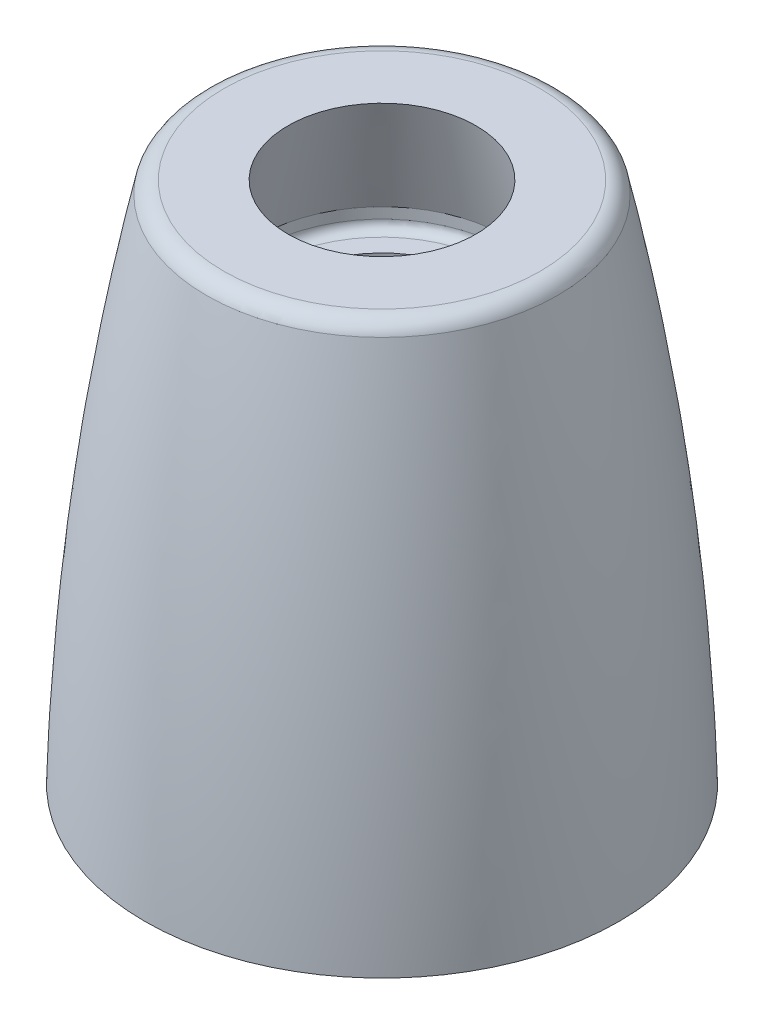
ISO-10303-21;
HEADER;
FILE_DESCRIPTION(('STEP AP214'),'2;1');
FILE_NAME('part.step','',(''),(''),'','','');
FILE_SCHEMA(('AUTOMOTIVE_DESIGN { 1 0 10303 214 1 1 1 1 }'));
ENDSEC;
DATA;
#1=APPLICATION_CONTEXT('core data for automotive mechanical design processes');
#2=APPLICATION_PROTOCOL_DEFINITION('international standard','automotive_design',2000,#1);
#3=PRODUCT_CONTEXT('',#1,'mechanical');
#4=PRODUCT('Part','Part','',(#3));
#5=PRODUCT_RELATED_PRODUCT_CATEGORY('part','',(#4));
#6=PRODUCT_DEFINITION_FORMATION('','',#4);
#7=PRODUCT_DEFINITION_CONTEXT('part definition',#1,'design');
#8=PRODUCT_DEFINITION('design','',#6,#7);
#9=PRODUCT_DEFINITION_SHAPE('','',#8);
#10=(LENGTH_UNIT() NAMED_UNIT(*) SI_UNIT(.MILLI.,.METRE.));
#11=(NAMED_UNIT(*) PLANE_ANGLE_UNIT() SI_UNIT($,.RADIAN.));
#12=(NAMED_UNIT(*) SI_UNIT($,.STERADIAN.) SOLID_ANGLE_UNIT());
#13=UNCERTAINTY_MEASURE_WITH_UNIT(LENGTH_MEASURE(1.E-05),#10,'distance_accuracy_value','');
#14=(GEOMETRIC_REPRESENTATION_CONTEXT(3) GLOBAL_UNCERTAINTY_ASSIGNED_CONTEXT((#13)) GLOBAL_UNIT_ASSIGNED_CONTEXT((#10,
#11,#12)) REPRESENTATION_CONTEXT('',''));
#15=CARTESIAN_POINT('',(0.,0.,0.));
#16=DIRECTION('',(0.,0.,1.));
#17=DIRECTION('',(1.,0.,0.));
#18=AXIS2_PLACEMENT_3D('',#15,#16,#17);
#19=CARTESIAN_POINT('',(0.,31.0037578537676,0.));
#20=DIRECTION('',(0.,1.,0.));
#21=DIRECTION('',(0.,0.,1.));
#22=AXIS2_PLACEMENT_3D('',#19,#20,#21);
#23=CYLINDRICAL_SURFACE('',#22,5.175);
#24=CARTESIAN_POINT('',(0.,24.3246111856191,0.));
#25=DIRECTION('',(0.,1.,0.));
#26=DIRECTION('',(0.,0.,1.));
#27=AXIS2_PLACEMENT_3D('',#24,#25,#26);
#28=CIRCLE('',#27,5.175);
#29=CARTESIAN_POINT('',(0.,24.3246111856191,5.175));
#30=VERTEX_POINT('',#29);
#31=CARTESIAN_POINT('',(0.,24.3246111856191,-5.175));
#32=VERTEX_POINT('',#31);
#33=EDGE_CURVE('E11',#30,#32,#28,.T.);
#34=ORIENTED_EDGE('',*,*,#33,.T.);
#35=DIRECTION('',(0.,-1.,0.));
#36=VECTOR('',#35,1.);
#37=CARTESIAN_POINT('',(0.,31.0037578537676,-5.175));
#38=LINE('',#37,#36);
#39=CARTESIAN_POINT('',(0.,15.7722628656191,-5.175));
#40=VERTEX_POINT('',#39);
#41=EDGE_CURVE('E27',#32,#40,#38,.T.);
#42=ORIENTED_EDGE('',*,*,#41,.T.);
#43=CARTESIAN_POINT('',(0.,15.7722628656191,0.));
#44=DIRECTION('',(0.,1.,0.));
#45=DIRECTION('',(0.,0.,1.));
#46=AXIS2_PLACEMENT_3D('',#43,#44,#45);
#47=CIRCLE('',#46,5.175);
#48=CARTESIAN_POINT('',(0.,15.7722628656191,5.175));
#49=VERTEX_POINT('',#48);
#50=EDGE_CURVE('E179',#49,#40,#47,.T.);
#51=ORIENTED_EDGE('',*,*,#50,.F.);
#52=CARTESIAN_POINT('',(0.,15.7722628656191,0.));
#53=DIRECTION('',(0.,1.,0.));
#54=DIRECTION('',(0.,0.,1.));
#55=AXIS2_PLACEMENT_3D('',#52,#53,#54);
#56=CIRCLE('',#55,5.175);
#57=EDGE_CURVE('E126',#40,#49,#56,.T.);
#58=ORIENTED_EDGE('',*,*,#57,.F.);
#59=ORIENTED_EDGE('',*,*,#41,.F.);
#60=CARTESIAN_POINT('',(0.,24.3246111856191,0.));
#61=DIRECTION('',(0.,1.,0.));
#62=DIRECTION('',(0.,0.,1.));
#63=AXIS2_PLACEMENT_3D('',#60,#61,#62);
#64=CIRCLE('',#63,5.175);
#65=EDGE_CURVE('E182',#32,#30,#64,.T.);
#66=ORIENTED_EDGE('',*,*,#65,.T.);
#67=EDGE_LOOP('',(#34,#42,#51,#58,#59,#66));
#68=FACE_BOUND('',#67,.T.);
#69=ADVANCED_FACE('F16',(#68),#23,.F.);
#70=CARTESIAN_POINT('',(0.,13.7722628656191,0.));
#71=DIRECTION('',(0.,-1.,0.));
#72=DIRECTION('',(0.,0.,1.));
#73=AXIS2_PLACEMENT_3D('',#70,#71,#72);
#74=TOROIDAL_SURFACE('',#73,7.779,2.);
#75=CARTESIAN_POINT('',(0.,15.7722628656191,0.));
#76=DIRECTION('',(0.,1.,0.));
#77=DIRECTION('',(0.,0.,1.));
#78=AXIS2_PLACEMENT_3D('',#75,#76,#77);
#79=CIRCLE('',#78,7.779);
#80=CARTESIAN_POINT('',(0.,15.7722628656191,7.779));
#81=VERTEX_POINT('',#80);
#82=CARTESIAN_POINT('',(0.,15.7722628656191,-7.779));
#83=VERTEX_POINT('',#82);
#84=EDGE_CURVE('E203',#81,#83,#79,.T.);
#85=ORIENTED_EDGE('',*,*,#84,.T.);
#86=CARTESIAN_POINT('',(0.,13.7722628656191,-7.779));
#87=DIRECTION('',(-1.,0.,0.));
#88=DIRECTION('',(0.,0.,-1.));
#89=AXIS2_PLACEMENT_3D('',#86,#87,#88);
#90=CIRCLE('',#89,2.);
#91=CARTESIAN_POINT('',(0.,13.7722628656191,-9.779));
#92=VERTEX_POINT('',#91);
#93=EDGE_CURVE('E200',#83,#92,#90,.T.);
#94=ORIENTED_EDGE('',*,*,#93,.T.);
#95=CARTESIAN_POINT('',(0.,13.7722628656191,0.));
#96=DIRECTION('',(0.,1.,0.));
#97=DIRECTION('',(0.,0.,1.));
#98=AXIS2_PLACEMENT_3D('',#95,#96,#97);
#99=CIRCLE('',#98,9.779);
#100=CARTESIAN_POINT('',(0.,13.7722628656191,9.779));
#101=VERTEX_POINT('',#100);
#102=EDGE_CURVE('E185',#101,#92,#99,.T.);
#103=ORIENTED_EDGE('',*,*,#102,.F.);
#104=CARTESIAN_POINT('',(0.,13.7722628656191,0.));
#105=DIRECTION('',(0.,1.,0.));
#106=DIRECTION('',(0.,0.,1.));
#107=AXIS2_PLACEMENT_3D('',#104,#105,#106);
#108=CIRCLE('',#107,9.779);
#109=EDGE_CURVE('E199',#92,#101,#108,.T.);
#110=ORIENTED_EDGE('',*,*,#109,.F.);
#111=ORIENTED_EDGE('',*,*,#93,.F.);
#112=CARTESIAN_POINT('',(0.,15.7722628656191,0.));
#113=DIRECTION('',(0.,1.,0.));
#114=DIRECTION('',(0.,0.,1.));
#115=AXIS2_PLACEMENT_3D('',#112,#113,#114);
#116=CIRCLE('',#115,7.779);
#117=EDGE_CURVE('E189',#83,#81,#116,.T.);
#118=ORIENTED_EDGE('',*,*,#117,.T.);
#119=EDGE_LOOP('',(#85,#94,#103,#110,#111,#118));
#120=FACE_BOUND('',#119,.T.);
#121=ADVANCED_FACE('F263',(#120),#74,.F.);
#122=CARTESIAN_POINT('',(0.,31.0037578537676,0.));
#123=DIRECTION('',(0.,1.,0.));
#124=DIRECTION('',(0.,0.,1.));
#125=AXIS2_PLACEMENT_3D('',#122,#123,#124);
#126=CYLINDRICAL_SURFACE('',#125,9.779);
#127=ORIENTED_EDGE('',*,*,#102,.T.);
#128=DIRECTION('',(0.,-1.,0.));
#129=VECTOR('',#128,1.);
#130=CARTESIAN_POINT('',(0.,31.0037578537676,-9.779));
#131=LINE('',#130,#129);
#132=CARTESIAN_POINT('',(0.,2.85961118561913,-9.779));
#133=VERTEX_POINT('',#132);
#134=EDGE_CURVE('E190',#92,#133,#131,.T.);
#135=ORIENTED_EDGE('',*,*,#134,.T.);
#136=CARTESIAN_POINT('',(0.,2.85961118561913,0.));
#137=DIRECTION('',(0.,1.,0.));
#138=DIRECTION('',(0.,0.,1.));
#139=AXIS2_PLACEMENT_3D('',#136,#137,#138);
#140=CIRCLE('',#139,9.779);
#141=CARTESIAN_POINT('',(0.,2.85961118561913,9.779));
#142=VERTEX_POINT('',#141);
#143=EDGE_CURVE('E195',#142,#133,#140,.T.);
#144=ORIENTED_EDGE('',*,*,#143,.F.);
#145=CARTESIAN_POINT('',(0.,2.85961118561913,0.));
#146=DIRECTION('',(0.,1.,0.));
#147=DIRECTION('',(0.,0.,1.));
#148=AXIS2_PLACEMENT_3D('',#145,#146,#147);
#149=CIRCLE('',#148,9.779);
#150=EDGE_CURVE('E191',#133,#142,#149,.T.);
#151=ORIENTED_EDGE('',*,*,#150,.F.);
#152=ORIENTED_EDGE('',*,*,#134,.F.);
#153=ORIENTED_EDGE('',*,*,#109,.T.);
#154=EDGE_LOOP('',(#127,#135,#144,#151,#152,#153));
#155=FACE_BOUND('',#154,.T.);
#156=ADVANCED_FACE('F232',(#155),#126,.F.);
#157=CARTESIAN_POINT('',(0.,30.7624474661681,-9.57948981229604));
#158=CARTESIAN_POINT('',(-9.57948981229604,30.7624474661681,-9.57948981229604));
#159=CARTESIAN_POINT('',(-9.57948981229604,30.7624474661681,0.));
#160=CARTESIAN_POINT('',(-9.57948981229604,30.7624474661681,9.57948981229604));
#161=CARTESIAN_POINT('',(0.,30.7624474661681,9.57948981229604));
#162=CARTESIAN_POINT('',(9.57948981229604,30.7624474661681,9.57948981229604));
#163=CARTESIAN_POINT('',(9.57948981229604,30.7624474661681,0.));
#164=CARTESIAN_POINT('',(9.57948981229604,30.7624474661681,-9.57948981229604));
#165=CARTESIAN_POINT('',(0.,30.7624474661681,-9.57948981229604));
#166=CARTESIAN_POINT('',(0.,16.9685337281054,-12.5685055574263));
#167=CARTESIAN_POINT('',(-12.5685055574263,16.9685337281054,-12.5685055574263));
#168=CARTESIAN_POINT('',(-12.5685055574263,16.9685337281054,0.));
#169=CARTESIAN_POINT('',(-12.5685055574263,16.9685337281054,12.5685055574263));
#170=CARTESIAN_POINT('',(0.,16.9685337281054,12.5685055574263));
#171=CARTESIAN_POINT('',(12.5685055574263,16.9685337281054,12.5685055574263));
#172=CARTESIAN_POINT('',(12.5685055574263,16.9685337281054,0.));
#173=CARTESIAN_POINT('',(12.5685055574263,16.9685337281054,-12.5685055574263));
#174=CARTESIAN_POINT('',(0.,16.9685337281054,-12.5685055574263));
#175=CARTESIAN_POINT('',(0.,2.8596111856191,-12.9487371025054));
#176=CARTESIAN_POINT('',(-12.9487371025054,2.8596111856191,-12.9487371025054));
#177=CARTESIAN_POINT('',(-12.9487371025054,2.8596111856191,0.));
#178=CARTESIAN_POINT('',(-12.9487371025054,2.8596111856191,12.9487371025054));
#179=CARTESIAN_POINT('',(0.,2.8596111856191,12.9487371025054));
#180=CARTESIAN_POINT('',(12.9487371025054,2.8596111856191,12.9487371025054));
#181=CARTESIAN_POINT('',(12.9487371025054,2.8596111856191,0.));
#182=CARTESIAN_POINT('',(12.9487371025054,2.8596111856191,-12.9487371025054));
#183=CARTESIAN_POINT('',(0.,2.8596111856191,-12.9487371025054));
#184=(BOUNDED_SURFACE() B_SPLINE_SURFACE(2,2,((#157,#158,#159,#160,#161,#162,#163,#164,#165),
(#166,#167,#168,#169,#170,#171,#172,#173,#174),(#175,#176,#177,#178,#179,#180,#181,#182,#183)),
.UNSPECIFIED.,.F.,.T.,.F.) B_SPLINE_SURFACE_WITH_KNOTS((3,3),(3,2,2,2,3),(-0.213391800025536,
-0.0269432007689089),(-3.14159265358979,-1.5707963267949,0.,1.5707963267949,3.14159265358979),
.UNSPECIFIED.) GEOMETRIC_REPRESENTATION_ITEM() RATIONAL_B_SPLINE_SURFACE(((1.,0.707106781186548,
1.,0.707106781186548,1.,0.707106781186548,1.,0.707106781186548,1.),(0.99565776112968,
0.704036354635812,0.99565776112968,0.704036354635812,0.99565776112968,0.704036354635812,
0.99565776112968,0.704036354635812,0.99565776112968),(1.,0.707106781186548,1.,0.707106781186548,
1.,0.707106781186548,1.,0.707106781186548,1.))) REPRESENTATION_ITEM('') SURFACE());
#185=CARTESIAN_POINT('',(0.,2.8596111856191,0.));
#186=DIRECTION('',(0.,1.,0.));
#187=DIRECTION('',(0.,0.,1.));
#188=AXIS2_PLACEMENT_3D('',#185,#186,#187);
#189=CIRCLE('',#188,12.9487371025054);
#190=CARTESIAN_POINT('',(0.,2.8596111856191,12.9487371025055));
#191=VERTEX_POINT('',#190);
#192=CARTESIAN_POINT('',(0.,2.8596111856191,-12.9487371025054));
#193=VERTEX_POINT('',#192);
#194=EDGE_CURVE('E137',#191,#193,#189,.T.);
#195=CARTESIAN_POINT('',(0.,-1.20724054969762,137.956407060144));
#196=DIRECTION('',(1.,0.,0.));
#197=DIRECTION('',(0.,0.,-1.));
#198=AXIS2_PLACEMENT_3D('',#195,#196,#197);
#199=CIRCLE('',#198,150.959934478613);
#200=CARTESIAN_POINT('',(0.,30.7624474661681,-9.57948981229606));
#201=VERTEX_POINT('',#200);
#202=EDGE_CURVE('E215',#193,#201,#199,.T.);
#203=CARTESIAN_POINT('',(0.,30.7624474661681,0.));
#204=DIRECTION('',(0.,1.,0.));
#205=DIRECTION('',(0.,0.,1.));
#206=AXIS2_PLACEMENT_3D('',#203,#204,#205);
#207=CIRCLE('',#206,9.57948981229606);
#208=CARTESIAN_POINT('',(0.,30.7624474661681,9.57948981229606));
#209=VERTEX_POINT('',#208);
#210=EDGE_CURVE('E151',#209,#201,#207,.T.);
#211=CARTESIAN_POINT('',(0.,30.7624474661681,0.));
#212=DIRECTION('',(0.,1.,0.));
#213=DIRECTION('',(0.,0.,1.));
#214=AXIS2_PLACEMENT_3D('',#211,#212,#213);
#215=CIRCLE('',#214,9.57948981229606);
#216=EDGE_CURVE('E152',#201,#209,#215,.T.);
#217=CARTESIAN_POINT('',(0.,2.8596111856191,0.));
#218=DIRECTION('',(0.,1.,0.));
#219=DIRECTION('',(0.,0.,1.));
#220=AXIS2_PLACEMENT_3D('',#217,#218,#219);
#221=CIRCLE('',#220,12.9487371025054);
#222=EDGE_CURVE('E160',#193,#191,#221,.T.);
#223=ORIENTED_EDGE('',*,*,#194,.T.);
#224=ORIENTED_EDGE('',*,*,#202,.T.);
#225=ORIENTED_EDGE('',*,*,#210,.F.);
#226=ORIENTED_EDGE('',*,*,#216,.F.);
#227=ORIENTED_EDGE('',*,*,#202,.F.);
#228=ORIENTED_EDGE('',*,*,#222,.T.);
#229=EDGE_LOOP('',(#223,#224,#225,#226,#227,#228));
#230=FACE_BOUND('',#229,.T.);
#231=ADVANCED_FACE('F288',(#230),#184,.T.);
#232=CARTESIAN_POINT('',(0.,30.4346111856202,0.));
#233=DIRECTION('',(0.,-1.,0.));
#234=DIRECTION('',(0.,0.,1.));
#235=AXIS2_PLACEMENT_3D('',#232,#233,#234);
#236=TOROIDAL_SURFACE('',#235,8.63475526060741,0.999999999998937);
#237=ORIENTED_EDGE('',*,*,#210,.T.);
#238=CARTESIAN_POINT('',(0.,30.4346111856202,-8.63475526060741));
#239=DIRECTION('',(1.,0.,0.));
#240=DIRECTION('',(0.,0.,-1.));
#241=AXIS2_PLACEMENT_3D('',#238,#239,#240);
#242=CIRCLE('',#241,0.999999999998937);
#243=CARTESIAN_POINT('',(0.,31.4346111856191,-8.63475526060741));
#244=VERTEX_POINT('',#243);
#245=EDGE_CURVE('E148',#201,#244,#242,.T.);
#246=ORIENTED_EDGE('',*,*,#245,.T.);
#247=CARTESIAN_POINT('',(0.,31.4346111856191,0.));
#248=DIRECTION('',(0.,1.,0.));
#249=DIRECTION('',(0.,0.,1.));
#250=AXIS2_PLACEMENT_3D('',#247,#248,#249);
#251=CIRCLE('',#250,8.63475526060741);
#252=CARTESIAN_POINT('',(0.,31.4346111856191,8.63475526060741));
#253=VERTEX_POINT('',#252);
#254=EDGE_CURVE('E205',#253,#244,#251,.T.);
#255=ORIENTED_EDGE('',*,*,#254,.F.);
#256=CARTESIAN_POINT('',(0.,31.4346111856191,0.));
#257=DIRECTION('',(0.,1.,0.));
#258=DIRECTION('',(0.,0.,1.));
#259=AXIS2_PLACEMENT_3D('',#256,#257,#258);
#260=CIRCLE('',#259,8.63475526060741);
#261=EDGE_CURVE('E209',#244,#253,#260,.T.);
#262=ORIENTED_EDGE('',*,*,#261,.F.);
#263=ORIENTED_EDGE('',*,*,#245,.F.);
#264=ORIENTED_EDGE('',*,*,#216,.T.);
#265=EDGE_LOOP('',(#237,#246,#255,#262,#263,#264));
#266=FACE_BOUND('',#265,.T.);
#267=ADVANCED_FACE('F18',(#266),#236,.T.);
#268=CARTESIAN_POINT('',(0.,31.4346111856191,0.));
#269=DIRECTION('',(0.,-1.,0.));
#270=DIRECTION('',(0.,0.,1.));
#271=AXIS2_PLACEMENT_3D('',#268,#269,#270);
#272=CONICAL_SURFACE('',#271,5.1308,0.259607300018462);
#273=CARTESIAN_POINT('',(0.,31.4346111856191,0.));
#274=DIRECTION('',(0.,1.,0.));
#275=DIRECTION('',(0.,0.,1.));
#276=AXIS2_PLACEMENT_3D('',#273,#274,#275);
#277=CIRCLE('',#276,5.1308);
#278=CARTESIAN_POINT('',(0.,31.4346111856191,5.1308));
#279=VERTEX_POINT('',#278);
#280=CARTESIAN_POINT('',(0.,31.4346111856191,-5.1308));
#281=VERTEX_POINT('',#280);
#282=EDGE_CURVE('E164',#279,#281,#277,.T.);
#283=ORIENTED_EDGE('',*,*,#282,.T.);
#284=DIRECTION('',(0.,-0.966490859144819,-0.256701030752721));
#285=VECTOR('',#284,1.);
#286=CARTESIAN_POINT('',(0.,31.4346111856191,-5.1308));
#287=LINE('',#286,#285);
#288=CARTESIAN_POINT('',(0.,25.4097866328367,-6.731));
#289=VERTEX_POINT('',#288);
#290=EDGE_CURVE('E142',#281,#289,#287,.T.);
#291=ORIENTED_EDGE('',*,*,#290,.T.);
#292=CARTESIAN_POINT('',(0.,25.4097866328367,0.));
#293=DIRECTION('',(0.,1.,0.));
#294=DIRECTION('',(0.,0.,1.));
#295=AXIS2_PLACEMENT_3D('',#292,#293,#294);
#296=CIRCLE('',#295,6.731);
#297=CARTESIAN_POINT('',(0.,25.4097866328367,6.731));
#298=VERTEX_POINT('',#297);
#299=EDGE_CURVE('E143',#298,#289,#296,.T.);
#300=ORIENTED_EDGE('',*,*,#299,.F.);
#301=CARTESIAN_POINT('',(0.,25.4097866328367,0.));
#302=DIRECTION('',(0.,1.,0.));
#303=DIRECTION('',(0.,0.,1.));
#304=AXIS2_PLACEMENT_3D('',#301,#302,#303);
#305=CIRCLE('',#304,6.731);
#306=EDGE_CURVE('E144',#289,#298,#305,.T.);
#307=ORIENTED_EDGE('',*,*,#306,.F.);
#308=ORIENTED_EDGE('',*,*,#290,.F.);
#309=CARTESIAN_POINT('',(0.,31.4346111856191,0.));
#310=DIRECTION('',(0.,1.,0.));
#311=DIRECTION('',(0.,0.,1.));
#312=AXIS2_PLACEMENT_3D('',#309,#310,#311);
#313=CIRCLE('',#312,5.1308);
#314=EDGE_CURVE('E139',#281,#279,#313,.T.);
#315=ORIENTED_EDGE('',*,*,#314,.T.);
#316=EDGE_LOOP('',(#283,#291,#300,#307,#308,#315));
#317=FACE_BOUND('',#316,.T.);
#318=ADVANCED_FACE('F287',(#317),#272,.F.);
#319=CARTESIAN_POINT('',(0.,31.0037578537676,0.));
#320=DIRECTION('',(0.,1.,0.));
#321=DIRECTION('',(0.,0.,1.));
#322=AXIS2_PLACEMENT_3D('',#319,#320,#321);
#323=CYLINDRICAL_SURFACE('',#322,6.731);
#324=ORIENTED_EDGE('',*,*,#299,.T.);
#325=DIRECTION('',(0.,-1.,0.));
#326=VECTOR('',#325,1.);
#327=CARTESIAN_POINT('',(0.,31.0037578537676,-6.731));
#328=LINE('',#327,#326);
#329=CARTESIAN_POINT('',(0.,24.8249911856191,-6.731));
#330=VERTEX_POINT('',#329);
#331=EDGE_CURVE('E147',#289,#330,#328,.T.);
#332=ORIENTED_EDGE('',*,*,#331,.T.);
#333=CARTESIAN_POINT('',(0.,24.8249911856191,0.));
#334=DIRECTION('',(0.,1.,0.));
#335=DIRECTION('',(0.,0.,1.));
#336=AXIS2_PLACEMENT_3D('',#333,#334,#335);
#337=CIRCLE('',#336,6.731);
#338=CARTESIAN_POINT('',(0.,24.8249911856191,6.731));
#339=VERTEX_POINT('',#338);
#340=EDGE_CURVE('E20',#339,#330,#337,.T.);
#341=ORIENTED_EDGE('',*,*,#340,.F.);
#342=CARTESIAN_POINT('',(0.,24.8249911856191,0.));
#343=DIRECTION('',(0.,1.,0.));
#344=DIRECTION('',(0.,0.,1.));
#345=AXIS2_PLACEMENT_3D('',#342,#343,#344);
#346=CIRCLE('',#345,6.731);
#347=EDGE_CURVE('E97',#330,#339,#346,.T.);
#348=ORIENTED_EDGE('',*,*,#347,.F.);
#349=ORIENTED_EDGE('',*,*,#331,.F.);
#350=ORIENTED_EDGE('',*,*,#306,.T.);
#351=EDGE_LOOP('',(#324,#332,#341,#348,#349,#350));
#352=FACE_BOUND('',#351,.T.);
#353=ADVANCED_FACE('F294',(#352),#323,.F.);
#354=CARTESIAN_POINT('',(0.,24.8249911856191,0.));
#355=DIRECTION('',(0.,-1.,0.));
#356=DIRECTION('',(0.,0.,1.));
#357=AXIS2_PLACEMENT_3D('',#354,#355,#356);
#358=TOROIDAL_SURFACE('',#357,6.23062,0.50038);
#359=ORIENTED_EDGE('',*,*,#340,.T.);
#360=CARTESIAN_POINT('',(0.,24.8249911856191,-6.23062));
#361=DIRECTION('',(-1.,0.,0.));
#362=DIRECTION('',(0.,0.,-1.));
#363=AXIS2_PLACEMENT_3D('',#360,#361,#362);
#364=CIRCLE('',#363,0.50038);
#365=CARTESIAN_POINT('',(0.,24.3246111856191,-6.23062));
#366=VERTEX_POINT('',#365);
#367=EDGE_CURVE('E123',#330,#366,#364,.T.);
#368=ORIENTED_EDGE('',*,*,#367,.T.);
#369=CARTESIAN_POINT('',(0.,24.3246111856191,0.));
#370=DIRECTION('',(0.,1.,0.));
#371=DIRECTION('',(0.,0.,1.));
#372=AXIS2_PLACEMENT_3D('',#369,#370,#371);
#373=CIRCLE('',#372,6.23062);
#374=CARTESIAN_POINT('',(0.,24.3246111856191,6.23062));
#375=VERTEX_POINT('',#374);
#376=EDGE_CURVE('E118',#375,#366,#373,.T.);
#377=ORIENTED_EDGE('',*,*,#376,.F.);
#378=CARTESIAN_POINT('',(0.,24.3246111856191,0.));
#379=DIRECTION('',(0.,1.,0.));
#380=DIRECTION('',(0.,0.,1.));
#381=AXIS2_PLACEMENT_3D('',#378,#379,#380);
#382=CIRCLE('',#381,6.23062);
#383=EDGE_CURVE('E122',#366,#375,#382,.T.);
#384=ORIENTED_EDGE('',*,*,#383,.F.);
#385=ORIENTED_EDGE('',*,*,#367,.F.);
#386=ORIENTED_EDGE('',*,*,#347,.T.);
#387=EDGE_LOOP('',(#359,#368,#377,#384,#385,#386));
#388=FACE_BOUND('',#387,.T.);
#389=ADVANCED_FACE('F120',(#388),#358,.F.);
#390=CARTESIAN_POINT('',(8.63475526060741,31.4346111856191,0.));
#391=DIRECTION('',(0.,-1.,0.));
#392=DIRECTION('',(0.,0.,-1.));
#393=AXIS2_PLACEMENT_3D('',#390,#391,#392);
#394=PLANE('',#393);
#395=ORIENTED_EDGE('',*,*,#254,.T.);
#396=ORIENTED_EDGE('',*,*,#261,.T.);
#397=EDGE_LOOP('',(#395,#396));
#398=FACE_BOUND('',#397,.T.);
#399=ORIENTED_EDGE('',*,*,#282,.F.);
#400=ORIENTED_EDGE('',*,*,#314,.F.);
#401=EDGE_LOOP('',(#399,#400));
#402=FACE_BOUND('',#401,.T.);
#403=ADVANCED_FACE('F284',(#398,#402),#394,.F.);
#404=CARTESIAN_POINT('',(9.779,2.85961118561911,0.));
#405=DIRECTION('',(0.,1.,0.));
#406=DIRECTION('',(1.,0.,0.));
#407=AXIS2_PLACEMENT_3D('',#404,#405,#406);
#408=PLANE('',#407);
#409=ORIENTED_EDGE('',*,*,#194,.F.);
#410=ORIENTED_EDGE('',*,*,#222,.F.);
#411=EDGE_LOOP('',(#409,#410));
#412=FACE_BOUND('',#411,.T.);
#413=ORIENTED_EDGE('',*,*,#143,.T.);
#414=ORIENTED_EDGE('',*,*,#150,.T.);
#415=EDGE_LOOP('',(#413,#414));
#416=FACE_BOUND('',#415,.T.);
#417=ADVANCED_FACE('F228',(#412,#416),#408,.F.);
#418=CARTESIAN_POINT('',(5.175,15.7722628656191,0.));
#419=DIRECTION('',(0.,1.,0.));
#420=DIRECTION('',(1.,0.,0.));
#421=AXIS2_PLACEMENT_3D('',#418,#419,#420);
#422=PLANE('',#421);
#423=ORIENTED_EDGE('',*,*,#84,.F.);
#424=ORIENTED_EDGE('',*,*,#117,.F.);
#425=EDGE_LOOP('',(#423,#424));
#426=FACE_BOUND('',#425,.T.);
#427=ORIENTED_EDGE('',*,*,#50,.T.);
#428=ORIENTED_EDGE('',*,*,#57,.T.);
#429=EDGE_LOOP('',(#427,#428));
#430=FACE_BOUND('',#429,.T.);
#431=ADVANCED_FACE('F251',(#426,#430),#422,.F.);
#432=CARTESIAN_POINT('',(6.23062,24.3246111856191,0.));
#433=DIRECTION('',(0.,-1.,0.));
#434=DIRECTION('',(0.,0.,-1.));
#435=AXIS2_PLACEMENT_3D('',#432,#433,#434);
#436=PLANE('',#435);
#437=ORIENTED_EDGE('',*,*,#376,.T.);
#438=ORIENTED_EDGE('',*,*,#383,.T.);
#439=EDGE_LOOP('',(#437,#438));
#440=FACE_BOUND('',#439,.T.);
#441=ORIENTED_EDGE('',*,*,#33,.F.);
#442=ORIENTED_EDGE('',*,*,#65,.F.);
#443=EDGE_LOOP('',(#441,#442));
#444=FACE_BOUND('',#443,.T.);
#445=ADVANCED_FACE('F128',(#440,#444),#436,.F.);
#446=CLOSED_SHELL('',(#69,#121,#156,#231,#267,#318,#353,#389,#403,#417,#431,#445));
#447=MANIFOLD_SOLID_BREP('B1',#446);
#448=ADVANCED_BREP_SHAPE_REPRESENTATION('',(#18,#447),#14);
#449=SHAPE_DEFINITION_REPRESENTATION(#9,#448);
ENDSEC;
END-ISO-10303-21;
